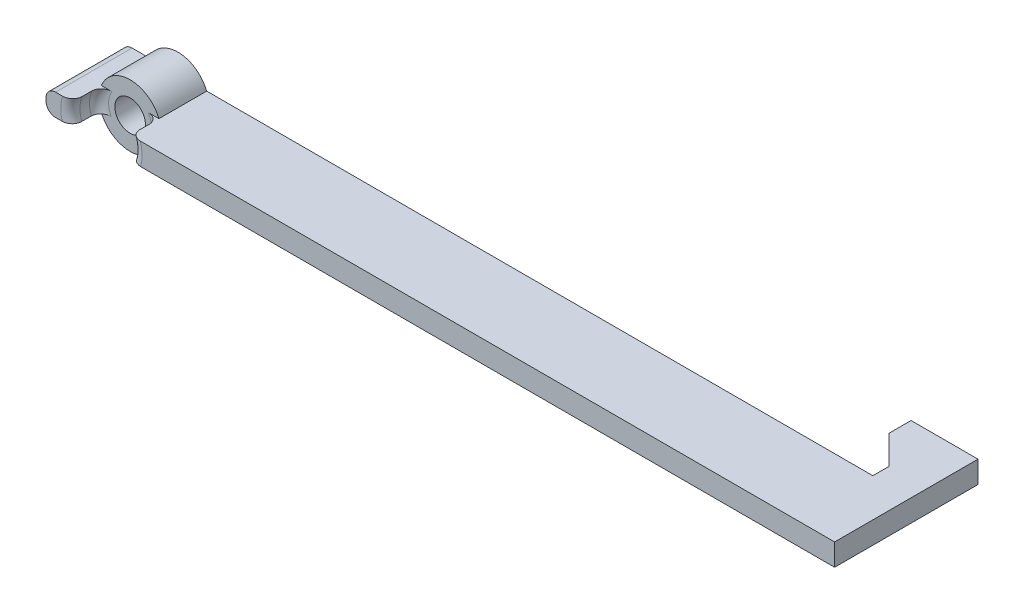
ISO-10303-21;
HEADER;
FILE_DESCRIPTION(('STEP AP214'),'2;1');
FILE_NAME('part.step','',(''),(''),'','','');
FILE_SCHEMA(('AUTOMOTIVE_DESIGN { 1 0 10303 214 1 1 1 1 }'));
ENDSEC;
DATA;
#1=APPLICATION_CONTEXT('core data for automotive mechanical design processes');
#2=APPLICATION_PROTOCOL_DEFINITION('international standard','automotive_design',2000,#1);
#3=PRODUCT_CONTEXT('',#1,'mechanical');
#4=PRODUCT('Part','Part','',(#3));
#5=PRODUCT_RELATED_PRODUCT_CATEGORY('part','',(#4));
#6=PRODUCT_DEFINITION_FORMATION('','',#4);
#7=PRODUCT_DEFINITION_CONTEXT('part definition',#1,'design');
#8=PRODUCT_DEFINITION('design','',#6,#7);
#9=PRODUCT_DEFINITION_SHAPE('','',#8);
#10=(LENGTH_UNIT() NAMED_UNIT(*) SI_UNIT(.MILLI.,.METRE.));
#11=(NAMED_UNIT(*) PLANE_ANGLE_UNIT() SI_UNIT($,.RADIAN.));
#12=(NAMED_UNIT(*) SI_UNIT($,.STERADIAN.) SOLID_ANGLE_UNIT());
#13=UNCERTAINTY_MEASURE_WITH_UNIT(LENGTH_MEASURE(1.E-05),#10,'distance_accuracy_value','');
#14=(GEOMETRIC_REPRESENTATION_CONTEXT(3) GLOBAL_UNCERTAINTY_ASSIGNED_CONTEXT((#13)) GLOBAL_UNIT_ASSIGNED_CONTEXT((#10,
#11,#12)) REPRESENTATION_CONTEXT('',''));
#15=CARTESIAN_POINT('',(0.,0.,0.));
#16=DIRECTION('',(0.,0.,1.));
#17=DIRECTION('',(1.,0.,0.));
#18=AXIS2_PLACEMENT_3D('',#15,#16,#17);
#19=CARTESIAN_POINT('',(0.,2.3,0.));
#20=DIRECTION('',(1.,0.,0.));
#21=DIRECTION('',(0.,0.,-1.));
#22=AXIS2_PLACEMENT_3D('',#19,#20,#21);
#23=PLANE('',#22);
#24=DIRECTION('',(0.,1.,0.));
#25=VECTOR('',#24,1.);
#26=CARTESIAN_POINT('',(0.,0.,-1.7));
#27=LINE('',#26,#25);
#28=CARTESIAN_POINT('',(0.,0.,-1.7));
#29=VERTEX_POINT('',#28);
#30=CARTESIAN_POINT('',(0.,2.3,-1.7));
#31=VERTEX_POINT('',#30);
#32=EDGE_CURVE('E204',#29,#31,#27,.T.);
#33=ORIENTED_EDGE('',*,*,#32,.F.);
#34=DIRECTION('',(0.,0.,1.));
#35=VECTOR('',#34,1.);
#36=CARTESIAN_POINT('',(0.,0.,0.));
#37=LINE('',#36,#35);
#38=CARTESIAN_POINT('',(0.,0.,0.));
#39=VERTEX_POINT('',#38);
#40=EDGE_CURVE('E193',#29,#39,#37,.T.);
#41=ORIENTED_EDGE('',*,*,#40,.T.);
#42=DIRECTION('',(0.,-1.,0.));
#43=VECTOR('',#42,1.);
#44=CARTESIAN_POINT('',(0.,2.3,0.));
#45=LINE('',#44,#43);
#46=CARTESIAN_POINT('',(0.,2.3,0.));
#47=VERTEX_POINT('',#46);
#48=EDGE_CURVE('E253',#47,#39,#45,.T.);
#49=ORIENTED_EDGE('',*,*,#48,.F.);
#50=DIRECTION('',(0.,0.,1.));
#51=VECTOR('',#50,1.);
#52=CARTESIAN_POINT('',(0.,2.3,0.));
#53=LINE('',#52,#51);
#54=EDGE_CURVE('E238',#31,#47,#53,.T.);
#55=ORIENTED_EDGE('',*,*,#54,.F.);
#56=EDGE_LOOP('',(#33,#41,#49,#55));
#57=FACE_BOUND('',#56,.T.);
#58=ADVANCED_FACE('F35',(#57),#23,.F.);
#59=CARTESIAN_POINT('',(4.,2.3,7.99999999999999));
#60=DIRECTION('',(0.,0.,-1.));
#61=DIRECTION('',(-1.,0.,0.));
#62=AXIS2_PLACEMENT_3D('',#59,#60,#61);
#63=PLANE('',#62);
#64=DIRECTION('',(1.,0.,0.));
#65=VECTOR('',#64,1.);
#66=CARTESIAN_POINT('',(4.,2.3,7.99999999999999));
#67=LINE('',#66,#65);
#68=CARTESIAN_POINT('',(-68.6298331944321,2.3,8.));
#69=VERTEX_POINT('',#68);
#70=CARTESIAN_POINT('',(4.,2.3,7.99999999999999));
#71=VERTEX_POINT('',#70);
#72=EDGE_CURVE('E230',#69,#71,#67,.T.);
#73=ORIENTED_EDGE('',*,*,#72,.F.);
#74=CARTESIAN_POINT('',(-72.7,1.07679021633533,8.));
#75=DIRECTION('',(0.,0.,-1.));
#76=DIRECTION('',(-1.,0.,0.));
#77=AXIS2_PLACEMENT_3D('',#74,#75,#76);
#78=CIRCLE('',#77,4.25000000000001);
#79=CARTESIAN_POINT('',(-68.5886714033047,0.,8.));
#80=VERTEX_POINT('',#79);
#81=EDGE_CURVE('E401',#69,#80,#78,.T.);
#82=ORIENTED_EDGE('',*,*,#81,.T.);
#83=DIRECTION('',(1.,0.,0.));
#84=VECTOR('',#83,1.);
#85=CARTESIAN_POINT('',(4.,0.,7.99999999999999));
#86=LINE('',#85,#84);
#87=CARTESIAN_POINT('',(4.,0.,7.99999999999999));
#88=VERTEX_POINT('',#87);
#89=EDGE_CURVE('E229',#80,#88,#86,.T.);
#90=ORIENTED_EDGE('',*,*,#89,.T.);
#91=DIRECTION('',(0.,-1.,0.));
#92=VECTOR('',#91,1.);
#93=CARTESIAN_POINT('',(4.,2.3,7.99999999999999));
#94=LINE('',#93,#92);
#95=EDGE_CURVE('E257',#71,#88,#94,.T.);
#96=ORIENTED_EDGE('',*,*,#95,.F.);
#97=EDGE_LOOP('',(#73,#82,#90,#96));
#98=FACE_BOUND('',#97,.T.);
#99=ADVANCED_FACE('F358',(#98),#63,.F.);
#100=CARTESIAN_POINT('',(-72.7,1.07679021633533,17.1923881554251));
#101=DIRECTION('',(0.,0.,-1.));
#102=DIRECTION('',(-1.,0.,0.));
#103=AXIS2_PLACEMENT_3D('',#100,#101,#102);
#104=CYLINDRICAL_SURFACE('',#103,3.25000000000001);
#105=DIRECTION('',(0.,0.,-1.));
#106=VECTOR('',#105,1.);
#107=CARTESIAN_POINT('',(-69.6335651270564,0.,17.1923881554251));
#108=LINE('',#107,#106);
#109=CARTESIAN_POINT('',(-69.6335651270564,0.,0.));
#110=VERTEX_POINT('',#109);
#111=CARTESIAN_POINT('',(-69.6335651270564,0.,4.99999999999999));
#112=VERTEX_POINT('',#111);
#113=EDGE_CURVE('E264',#110,#112,#108,.F.);
#114=ORIENTED_EDGE('',*,*,#113,.T.);
#115=CARTESIAN_POINT('',(-72.7,1.07679021633533,4.99999999999999));
#116=DIRECTION('',(0.,0.,1.));
#117=DIRECTION('',(1.,0.,0.));
#118=AXIS2_PLACEMENT_3D('',#115,#116,#117);
#119=CIRCLE('',#118,3.25000000000001);
#120=CARTESIAN_POINT('',(-75.7664348729436,0.,4.99999999999999));
#121=VERTEX_POINT('',#120);
#122=EDGE_CURVE('E208',#121,#112,#119,.T.);
#123=ORIENTED_EDGE('',*,*,#122,.F.);
#124=DIRECTION('',(0.,0.,-1.));
#125=VECTOR('',#124,1.);
#126=CARTESIAN_POINT('',(-75.7664348729436,0.,17.1923881554251));
#127=LINE('',#126,#125);
#128=CARTESIAN_POINT('',(-75.7664348729436,0.,0.));
#129=VERTEX_POINT('',#128);
#130=EDGE_CURVE('E267',#121,#129,#127,.T.);
#131=ORIENTED_EDGE('',*,*,#130,.T.);
#132=CARTESIAN_POINT('',(-72.7,1.07679021633533,0.));
#133=DIRECTION('',(0.,0.,-1.));
#134=DIRECTION('',(-1.,0.,0.));
#135=AXIS2_PLACEMENT_3D('',#132,#133,#134);
#136=CIRCLE('',#135,3.25000000000001);
#137=EDGE_CURVE('E217',#110,#129,#136,.T.);
#138=ORIENTED_EDGE('',*,*,#137,.F.);
#139=EDGE_LOOP('',(#114,#123,#131,#138));
#140=FACE_BOUND('',#139,.T.);
#141=ADVANCED_FACE('F295',(#140),#104,.T.);
#142=DIRECTION('',(0.,0.,-1.));
#143=VECTOR('',#142,1.);
#144=CARTESIAN_POINT('',(-75.7110227207956,2.3,17.1923881554251));
#145=LINE('',#144,#143);
#146=CARTESIAN_POINT('',(-75.7110227207956,2.3,4.99999999999999));
#147=VERTEX_POINT('',#146);
#148=CARTESIAN_POINT('',(-75.7110227207956,2.3,0.));
#149=VERTEX_POINT('',#148);
#150=EDGE_CURVE('E225',#147,#149,#145,.T.);
#151=ORIENTED_EDGE('',*,*,#150,.F.);
#152=CARTESIAN_POINT('',(-69.6889772792044,2.3,4.99999999999999));
#153=VERTEX_POINT('',#152);
#154=EDGE_CURVE('E210',#153,#147,#119,.T.);
#155=ORIENTED_EDGE('',*,*,#154,.F.);
#156=DIRECTION('',(0.,0.,-1.));
#157=VECTOR('',#156,1.);
#158=CARTESIAN_POINT('',(-69.6889772792044,2.3,17.1923881554251));
#159=LINE('',#158,#157);
#160=CARTESIAN_POINT('',(-69.6889772792044,2.3,0.));
#161=VERTEX_POINT('',#160);
#162=EDGE_CURVE('E222',#161,#153,#159,.F.);
#163=ORIENTED_EDGE('',*,*,#162,.F.);
#164=EDGE_CURVE('E218',#149,#161,#136,.T.);
#165=ORIENTED_EDGE('',*,*,#164,.F.);
#166=EDGE_LOOP('',(#151,#155,#163,#165));
#167=FACE_BOUND('',#166,.T.);
#168=ADVANCED_FACE('F444',(#167),#104,.T.);
#169=CARTESIAN_POINT('',(-72.7,1.07679021633533,12.5254833995939));
#170=DIRECTION('',(0.,0.,-1.));
#171=DIRECTION('',(-1.,0.,0.));
#172=AXIS2_PLACEMENT_3D('',#169,#170,#171);
#173=CYLINDRICAL_SURFACE('',#172,1.60000000000001);
#174=CARTESIAN_POINT('',(-72.7,1.07679021633533,0.));
#175=DIRECTION('',(0.,0.,-1.));
#176=DIRECTION('',(-1.,0.,0.));
#177=AXIS2_PLACEMENT_3D('',#174,#175,#176);
#178=CIRCLE('',#177,1.60000000000001);
#179=CARTESIAN_POINT('',(-74.3,1.07679021633533,0.));
#180=VERTEX_POINT('',#179);
#181=EDGE_CURVE('E214',#180,#180,#178,.T.);
#182=ORIENTED_EDGE('',*,*,#181,.T.);
#183=EDGE_LOOP('',(#182));
#184=FACE_BOUND('',#183,.T.);
#185=CARTESIAN_POINT('',(-72.7,1.07679021633533,4.99999999999999));
#186=DIRECTION('',(0.,0.,1.));
#187=DIRECTION('',(1.,0.,0.));
#188=AXIS2_PLACEMENT_3D('',#185,#186,#187);
#189=CIRCLE('',#188,1.60000000000001);
#190=CARTESIAN_POINT('',(-71.1,1.07679021633533,4.99999999999999));
#191=VERTEX_POINT('',#190);
#192=EDGE_CURVE('E213',#191,#191,#189,.F.);
#193=ORIENTED_EDGE('',*,*,#192,.F.);
#194=EDGE_LOOP('',(#193));
#195=FACE_BOUND('',#194,.T.);
#196=ADVANCED_FACE('F623',(#184,#195),#173,.F.);
#197=CARTESIAN_POINT('',(0.,2.3,0.));
#198=DIRECTION('',(0.,-1.,0.));
#199=DIRECTION('',(0.,0.,-1.));
#200=AXIS2_PLACEMENT_3D('',#197,#198,#199);
#201=PLANE('',#200);
#202=DIRECTION('',(-1.,0.,0.));
#203=VECTOR('',#202,1.);
#204=CARTESIAN_POINT('',(-78.5,2.3,0.));
#205=LINE('',#204,#203);
#206=CARTESIAN_POINT('',(-77.5,2.3,0.));
#207=VERTEX_POINT('',#206);
#208=EDGE_CURVE('E240',#149,#207,#205,.T.);
#209=ORIENTED_EDGE('',*,*,#208,.T.);
#210=DIRECTION('',(0.,0.,1.));
#211=VECTOR('',#210,1.);
#212=CARTESIAN_POINT('',(-77.5,2.3,0.));
#213=LINE('',#212,#211);
#214=CARTESIAN_POINT('',(-77.5,2.3,8.));
#215=VERTEX_POINT('',#214);
#216=EDGE_CURVE('E281',#207,#215,#213,.T.);
#217=ORIENTED_EDGE('',*,*,#216,.T.);
#218=CARTESIAN_POINT('',(-76.7701668055679,2.3,8.));
#219=VERTEX_POINT('',#218);
#220=EDGE_CURVE('E232',#215,#219,#67,.T.);
#221=ORIENTED_EDGE('',*,*,#220,.T.);
#222=CARTESIAN_POINT('',(-76.7701668055679,2.3,8.));
#223=CARTESIAN_POINT('',(-76.7084793020716,2.3,8.00003628166796));
#224=CARTESIAN_POINT('',(-76.6468129296311,2.3,7.99476679889679));
#225=CARTESIAN_POINT('',(-76.5252270284778,2.3,7.97400991228585));
#226=CARTESIAN_POINT('',(-76.4653073512022,2.3,7.95852338010756));
#227=CARTESIAN_POINT('',(-76.348886886151,2.3,7.91771836285723));
#228=CARTESIAN_POINT('',(-76.2923873654929,2.3,7.89239625930906));
#229=CARTESIAN_POINT('',(-76.1844912141994,2.3,7.83255453870914));
#230=CARTESIAN_POINT('',(-76.1330936020468,2.3,7.79803669548075));
#231=CARTESIAN_POINT('',(-76.0374776405936,2.3,7.7209760643413));
#232=CARTESIAN_POINT('',(-75.9931975907792,2.3,7.67851002971978));
#233=CARTESIAN_POINT('',(-75.9128411218953,2.3,7.58638298972124));
#234=CARTESIAN_POINT('',(-75.8767645163178,2.3,7.53672214796268));
#235=CARTESIAN_POINT('',(-75.8159286699387,2.3,7.43426156700221));
#236=CARTESIAN_POINT('',(-75.7906908007749,2.3,7.38174604062904));
#237=CARTESIAN_POINT('',(-75.7501652850212,2.3,7.27304603560976));
#238=CARTESIAN_POINT('',(-75.7348604807912,2.3,7.21686806895597));
#239=CARTESIAN_POINT('',(-75.720280800891,2.3,7.1334290201641));
#240=CARTESIAN_POINT('',(-75.7168113612721,2.3,7.10684542254565));
#241=CARTESIAN_POINT('',(-75.7121836279468,2.3,7.05351290005322));
#242=CARTESIAN_POINT('',(-75.7110223220466,2.3,7.02676423641359));
#243=CARTESIAN_POINT('',(-75.7110227207956,2.3,7.));
#244=B_SPLINE_CURVE_WITH_KNOTS('',3,(#222,#223,#224,#225,#226,#227,#228,#229,#230,#231,#232,
#233,#234,#235,#236,#237,#238,#239,#240,#241,#242,#243),.UNSPECIFIED.,.F.,.F.,(4,2,2,2,2,2,2,2,
2,2,4),(0.,0.184810026736351,0.369604288553864,0.554466600097478,0.739293278188422,
0.922419503712392,1.10554156538214,1.2794372901815,1.45303183527789,1.53337370125212,
1.61361064929914),.UNSPECIFIED.);
#245=CARTESIAN_POINT('',(-75.7110227207956,2.3,7.));
#246=VERTEX_POINT('',#245);
#247=EDGE_CURVE('E271',#219,#246,#244,.T.);
#248=ORIENTED_EDGE('',*,*,#247,.T.);
#249=CARTESIAN_POINT('',(-75.7110227207956,2.3,5.99999999999999));
#250=VERTEX_POINT('',#249);
#251=EDGE_CURVE('E226',#246,#250,#145,.T.);
#252=ORIENTED_EDGE('',*,*,#251,.T.);
#253=CARTESIAN_POINT('',(-75.7110227207956,2.3,5.99999999999999));
#254=CARTESIAN_POINT('',(-75.7110232626971,2.3,5.9735052240556));
#255=CARTESIAN_POINT('',(-75.7098854086374,2.3,5.94702354296903));
#256=CARTESIAN_POINT('',(-75.7053510431203,2.3,5.8942583169622));
#257=CARTESIAN_POINT('',(-75.7019548788933,2.3,5.86797474220997));
#258=CARTESIAN_POINT('',(-75.6884348932536,2.3,5.78983615144535));
#259=CARTESIAN_POINT('',(-75.6749793022308,2.3,5.73851919777151));
#260=CARTESIAN_POINT('',(-75.639671757554,2.3,5.63890135444684));
#261=CARTESIAN_POINT('',(-75.6178201007659,2.3,5.59060035822874));
#262=CARTESIAN_POINT('',(-75.5664894294616,2.3,5.49822575774662));
#263=CARTESIAN_POINT('',(-75.5370081175038,2.3,5.45415343230868));
#264=CARTESIAN_POINT('',(-75.4706451271862,2.3,5.37032085902143));
#265=CARTESIAN_POINT('',(-75.4336078325851,2.3,5.33068415771887));
#266=CARTESIAN_POINT('',(-75.3537880996448,2.3,5.25773428673599));
#267=CARTESIAN_POINT('',(-75.3110059810041,2.3,5.2244207654205));
#268=CARTESIAN_POINT('',(-75.2179232493511,2.3,5.16260396010052));
#269=CARTESIAN_POINT('',(-75.1673112891156,2.3,5.13457073447228));
#270=CARTESIAN_POINT('',(-75.0623759722074,2.3,5.08646985891002));
#271=CARTESIAN_POINT('',(-75.0080473391747,2.3,5.0664138208155));
#272=CARTESIAN_POINT('',(-74.8934438273873,2.3,5.03319527901055));
#273=CARTESIAN_POINT('',(-74.8330133705287,2.3,5.02057680233252));
#274=CARTESIAN_POINT('',(-74.7111694627277,2.3,5.0039727604889));
#275=CARTESIAN_POINT('',(-74.649759974041,2.3,4.99995847185423));
#276=CARTESIAN_POINT('',(-74.5884538186429,2.3,4.99999999999999));
#277=B_SPLINE_CURVE_WITH_KNOTS('',3,(#253,#254,#255,#256,#257,#258,#259,#260,#261,#262,#263,
#264,#265,#266,#267,#268,#269,#270,#271,#272,#273,#274,#275,#276),.UNSPECIFIED.,.F.,.F.,(4,2,2,
2,2,2,2,2,2,2,2,4),(0.,0.0794340962300351,0.158855981754892,0.317184376059872,0.475507172745226,
0.633877699169134,0.795917060797725,0.957947408695623,1.13080281141146,1.30390891492781,
1.48847066627677,1.67241532696246),.UNSPECIFIED.);
#278=CARTESIAN_POINT('',(-74.5884538186429,2.3,4.99999999999999));
#279=VERTEX_POINT('',#278);
#280=EDGE_CURVE('E312',#250,#279,#277,.T.);
#281=ORIENTED_EDGE('',*,*,#280,.T.);
#282=DIRECTION('',(1.,0.,0.));
#283=VECTOR('',#282,1.);
#284=CARTESIAN_POINT('',(-72.7,2.3,4.99999999999999));
#285=LINE('',#284,#283);
#286=EDGE_CURVE('E414',#147,#279,#285,.T.);
#287=ORIENTED_EDGE('',*,*,#286,.F.);
#288=ORIENTED_EDGE('',*,*,#150,.T.);
#289=EDGE_LOOP('',(#209,#217,#221,#248,#252,#281,#287,#288));
#290=FACE_BOUND('',#289,.T.);
#291=ADVANCED_FACE('F294',(#290),#201,.F.);
#292=CARTESIAN_POINT('',(0.,0.,0.));
#293=DIRECTION('',(0.,-1.,0.));
#294=DIRECTION('',(0.,0.,-1.));
#295=AXIS2_PLACEMENT_3D('',#292,#293,#294);
#296=PLANE('',#295);
#297=CARTESIAN_POINT('',(-77.5,0.,8.));
#298=VERTEX_POINT('',#297);
#299=CARTESIAN_POINT('',(-76.8113285966953,0.,8.));
#300=VERTEX_POINT('',#299);
#301=EDGE_CURVE('E245',#298,#300,#86,.T.);
#302=ORIENTED_EDGE('',*,*,#301,.F.);
#303=DIRECTION('',(0.,0.,1.));
#304=VECTOR('',#303,1.);
#305=CARTESIAN_POINT('',(-77.5,0.,0.));
#306=LINE('',#305,#304);
#307=CARTESIAN_POINT('',(-77.5,0.,0.));
#308=VERTEX_POINT('',#307);
#309=EDGE_CURVE('E456',#298,#308,#306,.F.);
#310=ORIENTED_EDGE('',*,*,#309,.T.);
#311=DIRECTION('',(-1.,0.,0.));
#312=VECTOR('',#311,1.);
#313=CARTESIAN_POINT('',(-78.5,0.,0.));
#314=LINE('',#313,#312);
#315=EDGE_CURVE('E248',#129,#308,#314,.T.);
#316=ORIENTED_EDGE('',*,*,#315,.F.);
#317=ORIENTED_EDGE('',*,*,#130,.F.);
#318=DIRECTION('',(-1.,0.,0.));
#319=VECTOR('',#318,1.);
#320=CARTESIAN_POINT('',(0.,0.,4.99999999999999));
#321=LINE('',#320,#319);
#322=CARTESIAN_POINT('',(-74.6756069523072,0.,4.99999999999999));
#323=VERTEX_POINT('',#322);
#324=EDGE_CURVE('E419',#323,#121,#321,.T.);
#325=ORIENTED_EDGE('',*,*,#324,.F.);
#326=CARTESIAN_POINT('',(-74.6756069523072,0.,4.99999999999999));
#327=CARTESIAN_POINT('',(-74.7090274255551,0.,5.00000068904523));
#328=CARTESIAN_POINT('',(-74.7424380873697,0.,5.00129285138581));
#329=CARTESIAN_POINT('',(-74.8090674786979,0.,5.00654129470269));
#330=CARTESIAN_POINT('',(-74.8422860874046,0.,5.0104991001755));
#331=CARTESIAN_POINT('',(-74.9415471697443,0.,5.0265245764561));
#332=CARTESIAN_POINT('',(-75.0069801087128,0.,5.04274538108086));
#333=CARTESIAN_POINT('',(-75.1342129533945,0.,5.08652969735452));
#334=CARTESIAN_POINT('',(-75.1959986374403,0.,5.11413463770462));
#335=CARTESIAN_POINT('',(-75.3132657119715,0.,5.1803362930904));
#336=CARTESIAN_POINT('',(-75.3687602751288,0.,5.21890942471922));
#337=CARTESIAN_POINT('',(-75.4664005147829,0.,5.30203977710945));
#338=CARTESIAN_POINT('',(-75.5093087364456,0.,5.34570216635517));
#339=CARTESIAN_POINT('',(-75.5864565449831,0.,5.44017033391898));
#340=CARTESIAN_POINT('',(-75.6206943121453,0.,5.49097760829632));
#341=CARTESIAN_POINT('',(-75.6767767578137,0.,5.59393748447642));
#342=CARTESIAN_POINT('',(-75.699376097865,0.,5.64568087326071));
#343=CARTESIAN_POINT('',(-75.7350942791199,0.,5.75229706672286));
#344=CARTESIAN_POINT('',(-75.7482290969488,0.,5.80716442818224));
#345=CARTESIAN_POINT('',(-75.7597393631419,0.,5.88543852883627));
#346=CARTESIAN_POINT('',(-75.7622503828411,0.,5.90829756239432));
#347=CARTESIAN_POINT('',(-75.7655962560331,0.,5.95410058614523));
#348=CARTESIAN_POINT('',(-75.76643383129,0.,5.97704437747974));
#349=CARTESIAN_POINT('',(-75.7664348729438,0.,5.99999999999995));
#350=B_SPLINE_CURVE_WITH_KNOTS('',3,(#326,#327,#328,#329,#330,#331,#332,#333,#334,#335,#336,
#337,#338,#339,#340,#341,#342,#343,#344,#345,#346,#347,#348,#349),.UNSPECIFIED.,.F.,.F.,(4,2,2,
2,2,2,2,2,2,2,2,4),(0.,0.100212853177123,0.200483067377465,0.401660231195516,0.603576063706577,
0.805060985148805,0.987736037051734,1.17044939618425,1.33900665267208,1.50727870454302,
1.57621898409396,1.64504704454937),.UNSPECIFIED.);
#351=CARTESIAN_POINT('',(-75.7664348729436,0.,5.99999999999999));
#352=VERTEX_POINT('',#351);
#353=EDGE_CURVE('E319',#323,#352,#350,.T.);
#354=ORIENTED_EDGE('',*,*,#353,.T.);
#355=CARTESIAN_POINT('',(-75.7664348729436,0.,7.));
#356=VERTEX_POINT('',#355);
#357=EDGE_CURVE('E268',#356,#352,#127,.T.);
#358=ORIENTED_EDGE('',*,*,#357,.F.);
#359=CARTESIAN_POINT('',(-75.7664348729436,0.,7.));
#360=CARTESIAN_POINT('',(-75.7664339434348,0.,7.02708754688897));
#361=CARTESIAN_POINT('',(-75.7676021687059,0.,7.05416156122703));
#362=CARTESIAN_POINT('',(-75.772255283119,0.,7.10810455051351));
#363=CARTESIAN_POINT('',(-75.7757397209928,0.,7.13497356437101));
#364=CARTESIAN_POINT('',(-75.7896040335199,0.,7.21484035235909));
#365=CARTESIAN_POINT('',(-75.8033952456551,0.,7.26728469948472));
#366=CARTESIAN_POINT('',(-75.8395316933238,0.,7.36908215077579));
#367=CARTESIAN_POINT('',(-75.8618749788424,0.,7.41843595665313));
#368=CARTESIAN_POINT('',(-75.9143119331562,0.,7.51285456521532));
#369=CARTESIAN_POINT('',(-75.9444085127079,0.,7.55791774838562));
#370=CARTESIAN_POINT('',(-76.0123113928244,0.,7.64386687953739));
#371=CARTESIAN_POINT('',(-76.0503096563918,0.,7.68460088385169));
#372=CARTESIAN_POINT('',(-76.1323150872758,0.,7.75949384390999));
#373=CARTESIAN_POINT('',(-76.1763240222754,0.,7.7936508582742));
#374=CARTESIAN_POINT('',(-76.2714874923135,0.,7.85619185182079));
#375=CARTESIAN_POINT('',(-76.3228904514077,0.,7.8841978486304));
#376=CARTESIAN_POINT('',(-76.4295599312125,0.,7.93147909407194));
#377=CARTESIAN_POINT('',(-76.4848257297999,0.,7.9507559695225));
#378=CARTESIAN_POINT('',(-76.5853338184707,0.,7.97688654217252));
#379=CARTESIAN_POINT('',(-76.6301180763736,0.,7.98553709933932));
#380=CARTESIAN_POINT('',(-76.7203720237144,0.,7.99709550161666));
#381=CARTESIAN_POINT('',(-76.7658409262242,0.,8.00000949795543));
#382=CARTESIAN_POINT('',(-76.8113285966953,0.,8.));
#383=B_SPLINE_CURVE_WITH_KNOTS('',3,(#359,#360,#361,#362,#363,#364,#365,#366,#367,#368,#369,
#370,#371,#372,#373,#374,#375,#376,#377,#378,#379,#380,#381,#382),.UNSPECIFIED.,.F.,.F.,(4,2,2,
2,2,2,2,2,2,2,2,4),(0.,0.0812108835898923,0.162405949479171,0.3242429832652,0.486043137477846,
0.647904123758225,0.81428879761123,0.980722509447689,1.15554912319839,1.33034314164523,
1.46682552576527,1.60316148198245),.UNSPECIFIED.);
#384=EDGE_CURVE('E453',#356,#300,#383,.T.);
#385=ORIENTED_EDGE('',*,*,#384,.T.);
#386=EDGE_LOOP('',(#302,#310,#316,#317,#325,#354,#358,#385));
#387=FACE_BOUND('',#386,.T.);
#388=ADVANCED_FACE('F378',(#387),#296,.T.);
#389=CARTESIAN_POINT('',(-78.5,2.3,8.));
#390=DIRECTION('',(1.,0.,0.));
#391=DIRECTION('',(0.,0.,-1.));
#392=AXIS2_PLACEMENT_3D('',#389,#390,#391);
#393=PLANE('',#392);
#394=DIRECTION('',(0.,-1.,0.));
#395=VECTOR('',#394,1.);
#396=CARTESIAN_POINT('',(-78.5,2.3,8.));
#397=LINE('',#396,#395);
#398=CARTESIAN_POINT('',(-78.5,1.3,8.));
#399=VERTEX_POINT('',#398);
#400=CARTESIAN_POINT('',(-78.5,1.,8.));
#401=VERTEX_POINT('',#400);
#402=EDGE_CURVE('E260',#399,#401,#397,.T.);
#403=ORIENTED_EDGE('',*,*,#402,.F.);
#404=DIRECTION('',(0.,0.,1.));
#405=VECTOR('',#404,1.);
#406=CARTESIAN_POINT('',(-78.5,1.3,8.));
#407=LINE('',#406,#405);
#408=CARTESIAN_POINT('',(-78.5,1.3,0.));
#409=VERTEX_POINT('',#408);
#410=EDGE_CURVE('E458',#399,#409,#407,.F.);
#411=ORIENTED_EDGE('',*,*,#410,.T.);
#412=DIRECTION('',(0.,-1.,0.));
#413=VECTOR('',#412,1.);
#414=CARTESIAN_POINT('',(-78.5,2.3,0.));
#415=LINE('',#414,#413);
#416=CARTESIAN_POINT('',(-78.5,1.,0.));
#417=VERTEX_POINT('',#416);
#418=EDGE_CURVE('E243',#409,#417,#415,.T.);
#419=ORIENTED_EDGE('',*,*,#418,.T.);
#420=DIRECTION('',(0.,0.,1.));
#421=VECTOR('',#420,1.);
#422=CARTESIAN_POINT('',(-78.5,1.,8.));
#423=LINE('',#422,#421);
#424=EDGE_CURVE('E498',#417,#401,#423,.T.);
#425=ORIENTED_EDGE('',*,*,#424,.T.);
#426=EDGE_LOOP('',(#403,#411,#419,#425));
#427=FACE_BOUND('',#426,.T.);
#428=ADVANCED_FACE('F374',(#427),#393,.F.);
#429=ORIENTED_EDGE('',*,*,#220,.F.);
#430=CARTESIAN_POINT('',(-77.5,1.3,8.));
#431=DIRECTION('',(0.,0.,-1.));
#432=DIRECTION('',(-1.,0.,0.));
#433=AXIS2_PLACEMENT_3D('',#430,#431,#432);
#434=CIRCLE('',#433,1.);
#435=EDGE_CURVE('E500',#215,#399,#434,.F.);
#436=ORIENTED_EDGE('',*,*,#435,.T.);
#437=ORIENTED_EDGE('',*,*,#402,.T.);
#438=CARTESIAN_POINT('',(-77.5,1.,8.));
#439=DIRECTION('',(0.,0.,-1.));
#440=DIRECTION('',(-1.,0.,0.));
#441=AXIS2_PLACEMENT_3D('',#438,#439,#440);
#442=CIRCLE('',#441,1.);
#443=EDGE_CURVE('E496',#401,#298,#442,.F.);
#444=ORIENTED_EDGE('',*,*,#443,.T.);
#445=ORIENTED_EDGE('',*,*,#301,.T.);
#446=CARTESIAN_POINT('',(-72.7,1.07679021633533,8.));
#447=DIRECTION('',(0.,0.,-1.));
#448=DIRECTION('',(-1.,0.,0.));
#449=AXIS2_PLACEMENT_3D('',#446,#447,#448);
#450=CIRCLE('',#449,4.25000000000001);
#451=EDGE_CURVE('E504',#300,#219,#450,.T.);
#452=ORIENTED_EDGE('',*,*,#451,.T.);
#453=EDGE_LOOP('',(#429,#436,#437,#444,#445,#452));
#454=FACE_BOUND('',#453,.T.);
#455=ADVANCED_FACE('F365',(#454),#63,.F.);
#456=CARTESIAN_POINT('',(4.,2.3,-7.00000000000001));
#457=DIRECTION('',(-1.,0.,0.));
#458=DIRECTION('',(0.,0.,1.));
#459=AXIS2_PLACEMENT_3D('',#456,#457,#458);
#460=PLANE('',#459);
#461=DIRECTION('',(0.,0.,-1.));
#462=VECTOR('',#461,1.);
#463=CARTESIAN_POINT('',(4.,0.,-7.00000000000001));
#464=LINE('',#463,#462);
#465=CARTESIAN_POINT('',(4.,0.,-7.00000000000001));
#466=VERTEX_POINT('',#465);
#467=EDGE_CURVE('E194',#88,#466,#464,.T.);
#468=ORIENTED_EDGE('',*,*,#467,.T.);
#469=DIRECTION('',(0.,-1.,0.));
#470=VECTOR('',#469,1.);
#471=CARTESIAN_POINT('',(4.,2.3,-7.00000000000001));
#472=LINE('',#471,#470);
#473=CARTESIAN_POINT('',(4.,2.3,-7.00000000000001));
#474=VERTEX_POINT('',#473);
#475=EDGE_CURVE('E191',#474,#466,#472,.T.);
#476=ORIENTED_EDGE('',*,*,#475,.F.);
#477=DIRECTION('',(0.,0.,-1.));
#478=VECTOR('',#477,1.);
#479=CARTESIAN_POINT('',(4.,2.3,-7.00000000000001));
#480=LINE('',#479,#478);
#481=EDGE_CURVE('E234',#71,#474,#480,.T.);
#482=ORIENTED_EDGE('',*,*,#481,.F.);
#483=ORIENTED_EDGE('',*,*,#95,.T.);
#484=EDGE_LOOP('',(#468,#476,#482,#483));
#485=FACE_BOUND('',#484,.T.);
#486=ADVANCED_FACE('F369',(#485),#460,.F.);
#487=CARTESIAN_POINT('',(0.,2.3,-7.00000000000001));
#488=DIRECTION('',(0.,0.,1.));
#489=DIRECTION('',(1.,0.,0.));
#490=AXIS2_PLACEMENT_3D('',#487,#488,#489);
#491=PLANE('',#490);
#492=DIRECTION('',(-1.,0.,0.));
#493=VECTOR('',#492,1.);
#494=CARTESIAN_POINT('',(0.,0.,-7.00000000000001));
#495=LINE('',#494,#493);
#496=CARTESIAN_POINT('',(-3.,0.,-7.00000000000001));
#497=VERTEX_POINT('',#496);
#498=EDGE_CURVE('E185',#466,#497,#495,.T.);
#499=ORIENTED_EDGE('',*,*,#498,.T.);
#500=DIRECTION('',(0.,-1.,0.));
#501=VECTOR('',#500,1.);
#502=CARTESIAN_POINT('',(-3.,0.,-7.00000000000001));
#503=LINE('',#502,#501);
#504=CARTESIAN_POINT('',(-3.,2.3,-7.00000000000001));
#505=VERTEX_POINT('',#504);
#506=EDGE_CURVE('E189',#505,#497,#503,.T.);
#507=ORIENTED_EDGE('',*,*,#506,.F.);
#508=DIRECTION('',(-1.,0.,0.));
#509=VECTOR('',#508,1.);
#510=CARTESIAN_POINT('',(0.,2.3,-7.00000000000001));
#511=LINE('',#510,#509);
#512=EDGE_CURVE('E236',#474,#505,#511,.T.);
#513=ORIENTED_EDGE('',*,*,#512,.F.);
#514=ORIENTED_EDGE('',*,*,#475,.T.);
#515=EDGE_LOOP('',(#499,#507,#513,#514));
#516=FACE_BOUND('',#515,.T.);
#517=ADVANCED_FACE('F186',(#516),#491,.F.);
#518=CARTESIAN_POINT('',(-78.5,2.3,0.));
#519=DIRECTION('',(0.,0.,1.));
#520=DIRECTION('',(1.,0.,0.));
#521=AXIS2_PLACEMENT_3D('',#518,#519,#520);
#522=PLANE('',#521);
#523=ORIENTED_EDGE('',*,*,#181,.F.);
#524=EDGE_LOOP('',(#523));
#525=FACE_BOUND('',#524,.T.);
#526=ORIENTED_EDGE('',*,*,#418,.F.);
#527=CARTESIAN_POINT('',(-77.5,1.3,0.));
#528=DIRECTION('',(0.,0.,1.));
#529=DIRECTION('',(1.,0.,0.));
#530=AXIS2_PLACEMENT_3D('',#527,#528,#529);
#531=CIRCLE('',#530,1.);
#532=EDGE_CURVE('E451',#409,#207,#531,.F.);
#533=ORIENTED_EDGE('',*,*,#532,.T.);
#534=ORIENTED_EDGE('',*,*,#208,.F.);
#535=ORIENTED_EDGE('',*,*,#164,.T.);
#536=EDGE_CURVE('E241',#47,#161,#205,.T.);
#537=ORIENTED_EDGE('',*,*,#536,.F.);
#538=ORIENTED_EDGE('',*,*,#48,.T.);
#539=EDGE_CURVE('E233',#39,#110,#314,.T.);
#540=ORIENTED_EDGE('',*,*,#539,.T.);
#541=ORIENTED_EDGE('',*,*,#137,.T.);
#542=ORIENTED_EDGE('',*,*,#315,.T.);
#543=CARTESIAN_POINT('',(-77.5,1.,0.));
#544=DIRECTION('',(0.,0.,1.));
#545=DIRECTION('',(1.,0.,0.));
#546=AXIS2_PLACEMENT_3D('',#543,#544,#545);
#547=CIRCLE('',#546,1.);
#548=EDGE_CURVE('E454',#308,#417,#547,.F.);
#549=ORIENTED_EDGE('',*,*,#548,.T.);
#550=EDGE_LOOP('',(#526,#533,#534,#535,#537,#538,#540,#541,#542,#549));
#551=FACE_BOUND('',#550,.T.);
#552=ADVANCED_FACE('F292',(#525,#551),#522,.F.);
#553=DIRECTION('',(0.,0.,-1.));
#554=VECTOR('',#553,1.);
#555=CARTESIAN_POINT('',(-3.,2.3,-7.00000000000001));
#556=LINE('',#555,#554);
#557=CARTESIAN_POINT('',(-3.,2.3,-4.7));
#558=VERTEX_POINT('',#557);
#559=EDGE_CURVE('E199',#558,#505,#556,.T.);
#560=ORIENTED_EDGE('',*,*,#559,.F.);
#561=DIRECTION('',(-0.707106781186548,0.,-0.707106781186547));
#562=VECTOR('',#561,1.);
#563=CARTESIAN_POINT('',(-3.,2.3,-4.7));
#564=LINE('',#563,#562);
#565=EDGE_CURVE('E44',#558,#31,#564,.F.);
#566=ORIENTED_EDGE('',*,*,#565,.T.);
#567=ORIENTED_EDGE('',*,*,#54,.T.);
#568=ORIENTED_EDGE('',*,*,#536,.T.);
#569=ORIENTED_EDGE('',*,*,#162,.T.);
#570=DIRECTION('',(1.,0.,0.));
#571=VECTOR('',#570,1.);
#572=CARTESIAN_POINT('',(-72.7,2.3,4.99999999999999));
#573=LINE('',#572,#571);
#574=CARTESIAN_POINT('',(-70.8115461813571,2.3,4.99999999999999));
#575=VERTEX_POINT('',#574);
#576=EDGE_CURVE('E412',#575,#153,#573,.T.);
#577=ORIENTED_EDGE('',*,*,#576,.F.);
#578=CARTESIAN_POINT('',(-70.8115461813571,2.3,4.99999999999999));
#579=CARTESIAN_POINT('',(-70.7760104532668,2.3,5.00000085708769));
#580=CARTESIAN_POINT('',(-70.7404830804914,2.3,5.00133574199818));
#581=CARTESIAN_POINT('',(-70.6696164473074,2.3,5.00679883344536));
#582=CARTESIAN_POINT('',(-70.6342773638186,2.3,5.01092931576619));
#583=CARTESIAN_POINT('',(-70.5285084991888,2.3,5.02775951526121));
#584=CARTESIAN_POINT('',(-70.4587148982414,2.3,5.04490082845419));
#585=CARTESIAN_POINT('',(-70.3229928261293,2.3,5.09161465659027));
#586=CARTESIAN_POINT('',(-70.2570856865169,2.3,5.12124959975095));
#587=CARTESIAN_POINT('',(-70.1324421449753,2.3,5.19274761746729));
#588=CARTESIAN_POINT('',(-70.0736840193738,2.3,5.23457226547921));
#589=CARTESIAN_POINT('',(-69.9731829929628,2.3,5.32319844432243));
#590=CARTESIAN_POINT('',(-69.9302180997743,2.3,5.36861655924005));
#591=CARTESIAN_POINT('',(-69.8535442571083,2.3,5.46676695166108));
#592=CARTESIAN_POINT('',(-69.8198374217272,2.3,5.51950089561815));
#593=CARTESIAN_POINT('',(-69.7661759866786,2.3,5.62483333154886));
#594=CARTESIAN_POINT('',(-69.7451714498463,2.3,5.6769002376762));
#595=CARTESIAN_POINT('',(-69.7127953473834,2.3,5.78388880414084));
#596=CARTESIAN_POINT('',(-69.7014033699654,2.3,5.83880415122239));
#597=CARTESIAN_POINT('',(-69.6930150015946,2.3,5.91178456087184));
#598=CARTESIAN_POINT('',(-69.6915004520382,2.3,5.92940768954688));
#599=CARTESIAN_POINT('',(-69.6894830105475,2.3,5.96468448153033));
#600=CARTESIAN_POINT('',(-69.6889785598331,2.3,5.98233805564783));
#601=CARTESIAN_POINT('',(-69.6889772792044,2.3,5.99999999999999));
#602=B_SPLINE_CURVE_WITH_KNOTS('',3,(#578,#579,#580,#581,#582,#583,#584,#585,#586,#587,#588,
#589,#590,#591,#592,#593,#594,#595,#596,#597,#598,#599,#600,#601),.UNSPECIFIED.,.F.,.F.,(4,2,2,
2,2,2,2,2,2,2,2,4),(0.,0.106559591770098,0.213206033947683,0.427648727549265,0.643175892655687,
0.85803085095982,1.04455561838715,1.2311229437825,1.39871743039911,1.56595513649362,
1.61899897556331,1.67196089432831),.UNSPECIFIED.);
#603=CARTESIAN_POINT('',(-69.6889772792044,2.3,5.99999999999999));
#604=VERTEX_POINT('',#603);
#605=EDGE_CURVE('E318',#575,#604,#602,.T.);
#606=ORIENTED_EDGE('',*,*,#605,.T.);
#607=CARTESIAN_POINT('',(-69.6889772792044,2.3,7.));
#608=VERTEX_POINT('',#607);
#609=EDGE_CURVE('E221',#604,#608,#159,.F.);
#610=ORIENTED_EDGE('',*,*,#609,.T.);
#611=CARTESIAN_POINT('',(-69.6889772792044,2.3,7.));
#612=CARTESIAN_POINT('',(-69.6889785477059,2.3,7.02677529264485));
#613=CARTESIAN_POINT('',(-69.687815729685,2.3,7.05353701657777));
#614=CARTESIAN_POINT('',(-69.6831864338887,2.3,7.10685409621262));
#615=CARTESIAN_POINT('',(-69.6797205117405,2.3,7.13340950012665));
#616=CARTESIAN_POINT('',(-69.6659400296055,2.3,7.21231059726241));
#617=CARTESIAN_POINT('',(-69.6522423150588,2.3,7.26410333208408));
#618=CARTESIAN_POINT('',(-69.6164127011562,2.3,7.36461199447424));
#619=CARTESIAN_POINT('',(-69.5942845637694,2.3,7.41332928313453));
#620=CARTESIAN_POINT('',(-69.5424381799985,2.3,7.50656360496706));
#621=CARTESIAN_POINT('',(-69.5127158868507,2.3,7.55107838133581));
#622=CARTESIAN_POINT('',(-69.4454931757676,2.3,7.63641139504619));
#623=CARTESIAN_POINT('',(-69.4077514591364,2.3,7.67703910285028));
#624=CARTESIAN_POINT('',(-69.3263608155521,2.3,7.75186945252776));
#625=CARTESIAN_POINT('',(-69.2827100505801,2.3,7.78607008731324));
#626=CARTESIAN_POINT('',(-69.1876405683606,2.3,7.84940349070154));
#627=CARTESIAN_POINT('',(-69.1358991490483,2.3,7.87805203660211));
#628=CARTESIAN_POINT('',(-69.0284856135634,2.3,7.92665346073275));
#629=CARTESIAN_POINT('',(-68.9728137649173,2.3,7.94660693013577));
#630=CARTESIAN_POINT('',(-68.8693212718776,2.3,7.97456662670588));
#631=CARTESIAN_POINT('',(-68.8219018597096,2.3,7.98408100737039));
#632=CARTESIAN_POINT('',(-68.7262719750473,2.3,7.99680010565824));
#633=CARTESIAN_POINT('',(-68.6780623116886,2.3,8.00001091468145));
#634=CARTESIAN_POINT('',(-68.6298331944321,2.3,8.));
#635=B_SPLINE_CURVE_WITH_KNOTS('',3,(#611,#612,#613,#614,#615,#616,#617,#618,#619,#620,#621,
#622,#623,#624,#625,#626,#627,#628,#629,#630,#631,#632,#633,#634),.UNSPECIFIED.,.F.,.F.,(4,2,2,
2,2,2,2,2,2,2,2,4),(0.,0.0802740855491039,0.160528811886289,0.320410273854187,0.480220474156693,
0.640116012167943,0.805762297134226,0.971460225541835,1.14810745166644,1.32474266577899,
1.46942939316783,1.61397623488132),.UNSPECIFIED.);
#636=EDGE_CURVE('E304',#608,#69,#635,.T.);
#637=ORIENTED_EDGE('',*,*,#636,.T.);
#638=ORIENTED_EDGE('',*,*,#72,.T.);
#639=ORIENTED_EDGE('',*,*,#481,.T.);
#640=ORIENTED_EDGE('',*,*,#512,.T.);
#641=EDGE_LOOP('',(#560,#566,#567,#568,#569,#577,#606,#610,#637,#638,#639,#640));
#642=FACE_BOUND('',#641,.T.);
#643=ADVANCED_FACE('F287',(#642),#201,.F.);
#644=ORIENTED_EDGE('',*,*,#40,.F.);
#645=DIRECTION('',(0.707106781186548,0.,0.707106781186547));
#646=VECTOR('',#645,1.);
#647=CARTESIAN_POINT('',(0.850000000000005,0.,-0.850000000000007));
#648=LINE('',#647,#646);
#649=CARTESIAN_POINT('',(-3.,0.,-4.7));
#650=VERTEX_POINT('',#649);
#651=EDGE_CURVE('E11',#29,#650,#648,.F.);
#652=ORIENTED_EDGE('',*,*,#651,.T.);
#653=DIRECTION('',(0.,0.,1.));
#654=VECTOR('',#653,1.);
#655=CARTESIAN_POINT('',(-3.,0.,-7.00000000000001));
#656=LINE('',#655,#654);
#657=EDGE_CURVE('E196',#497,#650,#656,.T.);
#658=ORIENTED_EDGE('',*,*,#657,.F.);
#659=ORIENTED_EDGE('',*,*,#498,.F.);
#660=ORIENTED_EDGE('',*,*,#467,.F.);
#661=ORIENTED_EDGE('',*,*,#89,.F.);
#662=CARTESIAN_POINT('',(-68.5886714033047,0.,8.));
#663=CARTESIAN_POINT('',(-68.6490313113149,0.,8.00003928539847));
#664=CARTESIAN_POINT('',(-68.7093720616342,0.,7.9948880352838));
#665=CARTESIAN_POINT('',(-68.8283349036399,0.,7.97458654147727));
#666=CARTESIAN_POINT('',(-68.8869574110799,0.,7.95943873780718));
#667=CARTESIAN_POINT('',(-69.0008573757739,0.,7.91951784638248));
#668=CARTESIAN_POINT('',(-69.0561334799272,0.,7.89474089478115));
#669=CARTESIAN_POINT('',(-69.1617015985119,0.,7.83620762137324));
#670=CARTESIAN_POINT('',(-69.2119946095939,0.,7.80245310013444));
#671=CARTESIAN_POINT('',(-69.30571503646,0.,7.72706573411015));
#672=CARTESIAN_POINT('',(-69.3491879488644,0.,7.68548955850754));
#673=CARTESIAN_POINT('',(-69.4282141930805,0.,7.59535976268737));
#674=CARTESIAN_POINT('',(-69.4637671618081,0.,7.54680582274695));
#675=CARTESIAN_POINT('',(-69.5243952759372,0.,7.44605018198395));
#676=CARTESIAN_POINT('',(-69.5498169941892,0.,7.3940569759492));
#677=CARTESIAN_POINT('',(-69.590993831413,0.,7.28640724128436));
#678=CARTESIAN_POINT('',(-69.6067628026231,0.,7.23075608970982));
#679=CARTESIAN_POINT('',(-69.6227507567871,0.,7.14546884098321));
#680=CARTESIAN_POINT('',(-69.6268032348904,0.,7.11650550801508));
#681=CARTESIAN_POINT('',(-69.6322093290484,0.,7.05836676798631));
#682=CARTESIAN_POINT('',(-69.6335665009062,0.,7.02919169136848));
#683=CARTESIAN_POINT('',(-69.6335651270564,0.,7.));
#684=B_SPLINE_CURVE_WITH_KNOTS('',3,(#662,#663,#664,#665,#666,#667,#668,#669,#670,#671,#672,
#673,#674,#675,#676,#677,#678,#679,#680,#681,#682,#683),.UNSPECIFIED.,.F.,.F.,(4,2,2,2,2,2,2,2,
2,2,4),(0.,0.180834690484573,0.361625258016195,0.542488445628425,0.723315386106194,
0.902879419275937,1.08245168273794,1.25520587925169,1.42771157894084,1.5153382900479,
1.60284932196063),.UNSPECIFIED.);
#685=CARTESIAN_POINT('',(-69.6335651270564,0.,7.));
#686=VERTEX_POINT('',#685);
#687=EDGE_CURVE('E394',#80,#686,#684,.T.);
#688=ORIENTED_EDGE('',*,*,#687,.T.);
#689=CARTESIAN_POINT('',(-69.6335651270564,0.,5.99999999999999));
#690=VERTEX_POINT('',#689);
#691=EDGE_CURVE('E263',#690,#686,#108,.F.);
#692=ORIENTED_EDGE('',*,*,#691,.F.);
#693=CARTESIAN_POINT('',(-69.6335651270564,0.,5.99999999999999));
#694=CARTESIAN_POINT('',(-69.6335647487659,0.,5.97312699134495));
#695=CARTESIAN_POINT('',(-69.6347139843592,0.,5.94626715937973));
#696=CARTESIAN_POINT('',(-69.6392948801433,0.,5.89274629906693));
#697=CARTESIAN_POINT('',(-69.6427262459307,0.,5.86608524552473));
#698=CARTESIAN_POINT('',(-69.656392427684,0.,5.78680136591764));
#699=CARTESIAN_POINT('',(-69.6699995559626,0.,5.73472069052587));
#700=CARTESIAN_POINT('',(-69.7057396261046,0.,5.63360455125095));
#701=CARTESIAN_POINT('',(-69.7278732783818,0.,5.58456934150565));
#702=CARTESIAN_POINT('',(-69.7799203929658,0.,5.49080998796457));
#703=CARTESIAN_POINT('',(-69.8098353445077,0.,5.44608667165486));
#704=CARTESIAN_POINT('',(-69.8770850505908,0.,5.36128777760898));
#705=CARTESIAN_POINT('',(-69.9145452779945,0.,5.32131194158024));
#706=CARTESIAN_POINT('',(-69.995343088151,0.,5.24785084992162));
#707=CARTESIAN_POINT('',(-70.0386807018415,0.,5.21436562845976));
#708=CARTESIAN_POINT('',(-70.1323547529892,0.,5.15291041707119));
#709=CARTESIAN_POINT('',(-70.1829377740879,0.,5.12531714919389));
#710=CARTESIAN_POINT('',(-70.2878018081165,0.,5.07828299915218));
#711=CARTESIAN_POINT('',(-70.3420865356937,0.,5.05885045044784));
#712=CARTESIAN_POINT('',(-70.4507070237035,0.,5.02882902000857));
#713=CARTESIAN_POINT('',(-70.5049560224494,0.,5.01792105199579));
#714=CARTESIAN_POINT('',(-70.6142863403535,0.,5.00350255505706));
#715=CARTESIAN_POINT('',(-70.669364999727,0.,4.99997202149175));
#716=CARTESIAN_POINT('',(-70.7243930476928,0.,4.99999999999999));
#717=B_SPLINE_CURVE_WITH_KNOTS('',3,(#693,#694,#695,#696,#697,#698,#699,#700,#701,#702,#703,
#704,#705,#706,#707,#708,#709,#710,#711,#712,#713,#714,#715,#716),.UNSPECIFIED.,.F.,.F.,(4,2,2,
2,2,2,2,2,2,2,2,4),(0.,0.0805684449541831,0.161126498287939,0.321777341766831,0.482441573266442,
0.64313657637146,0.80676489832703,0.970394081634974,1.14252081309907,1.3148228898516,
1.48031712332142,1.6453620174551),.UNSPECIFIED.);
#718=CARTESIAN_POINT('',(-70.7243930476928,0.,4.99999999999999));
#719=VERTEX_POINT('',#718);
#720=EDGE_CURVE('E340',#690,#719,#717,.T.);
#721=ORIENTED_EDGE('',*,*,#720,.T.);
#722=DIRECTION('',(-1.,0.,0.));
#723=VECTOR('',#722,1.);
#724=CARTESIAN_POINT('',(0.,0.,4.99999999999999));
#725=LINE('',#724,#723);
#726=EDGE_CURVE('E406',#112,#719,#725,.T.);
#727=ORIENTED_EDGE('',*,*,#726,.F.);
#728=ORIENTED_EDGE('',*,*,#113,.F.);
#729=ORIENTED_EDGE('',*,*,#539,.F.);
#730=EDGE_LOOP('',(#644,#652,#658,#659,#660,#661,#688,#692,#721,#727,#728,#729));
#731=FACE_BOUND('',#730,.T.);
#732=ADVANCED_FACE('F197',(#731),#296,.T.);
#733=CARTESIAN_POINT('',(-72.7,1.07679021633533,4.99999999999999));
#734=DIRECTION('',(0.,0.,1.));
#735=DIRECTION('',(1.,0.,0.));
#736=AXIS2_PLACEMENT_3D('',#733,#734,#735);
#737=CYLINDRICAL_SURFACE('',#736,3.25000000000001);
#738=ORIENTED_EDGE('',*,*,#251,.F.);
#739=CARTESIAN_POINT('',(-72.7,1.07679021633533,7.));
#740=DIRECTION('',(0.,0.,-1.));
#741=DIRECTION('',(-1.,0.,0.));
#742=AXIS2_PLACEMENT_3D('',#739,#740,#741);
#743=CIRCLE('',#742,3.25000000000001);
#744=EDGE_CURVE('E403',#246,#356,#743,.F.);
#745=ORIENTED_EDGE('',*,*,#744,.T.);
#746=ORIENTED_EDGE('',*,*,#357,.T.);
#747=CARTESIAN_POINT('',(-72.7,1.07679021633533,5.99999999999999));
#748=DIRECTION('',(0.,0.,1.));
#749=DIRECTION('',(1.,0.,0.));
#750=AXIS2_PLACEMENT_3D('',#747,#748,#749);
#751=CIRCLE('',#750,3.25000000000001);
#752=EDGE_CURVE('E400',#352,#250,#751,.F.);
#753=ORIENTED_EDGE('',*,*,#752,.T.);
#754=EDGE_LOOP('',(#738,#745,#746,#753));
#755=FACE_BOUND('',#754,.T.);
#756=ADVANCED_FACE('F432',(#755),#737,.F.);
#757=ORIENTED_EDGE('',*,*,#691,.T.);
#758=CARTESIAN_POINT('',(-72.7,1.07679021633533,7.));
#759=DIRECTION('',(0.,0.,-1.));
#760=DIRECTION('',(-1.,0.,0.));
#761=AXIS2_PLACEMENT_3D('',#758,#759,#760);
#762=CIRCLE('',#761,3.25000000000001);
#763=EDGE_CURVE('E468',#686,#608,#762,.F.);
#764=ORIENTED_EDGE('',*,*,#763,.T.);
#765=ORIENTED_EDGE('',*,*,#609,.F.);
#766=CARTESIAN_POINT('',(-72.7,1.07679021633533,5.99999999999999));
#767=DIRECTION('',(0.,0.,1.));
#768=DIRECTION('',(1.,0.,0.));
#769=AXIS2_PLACEMENT_3D('',#766,#767,#768);
#770=CIRCLE('',#769,3.25000000000001);
#771=EDGE_CURVE('E467',#604,#690,#770,.F.);
#772=ORIENTED_EDGE('',*,*,#771,.T.);
#773=EDGE_LOOP('',(#757,#764,#765,#772));
#774=FACE_BOUND('',#773,.T.);
#775=ADVANCED_FACE('F483',(#774),#737,.F.);
#776=CARTESIAN_POINT('',(-72.7,1.07679021633533,4.99999999999999));
#777=DIRECTION('',(0.,0.,1.));
#778=DIRECTION('',(1.,0.,0.));
#779=AXIS2_PLACEMENT_3D('',#776,#777,#778);
#780=PLANE('',#779);
#781=CARTESIAN_POINT('',(-72.7,1.07679021633533,4.99999999999999));
#782=DIRECTION('',(0.,0.,1.));
#783=DIRECTION('',(1.,0.,0.));
#784=AXIS2_PLACEMENT_3D('',#781,#782,#783);
#785=CIRCLE('',#784,2.25000000000001);
#786=EDGE_CURVE('E417',#279,#323,#785,.T.);
#787=ORIENTED_EDGE('',*,*,#786,.T.);
#788=ORIENTED_EDGE('',*,*,#324,.T.);
#789=ORIENTED_EDGE('',*,*,#122,.T.);
#790=ORIENTED_EDGE('',*,*,#726,.T.);
#791=CARTESIAN_POINT('',(-72.7,1.07679021633533,4.99999999999999));
#792=DIRECTION('',(0.,0.,1.));
#793=DIRECTION('',(1.,0.,0.));
#794=AXIS2_PLACEMENT_3D('',#791,#792,#793);
#795=CIRCLE('',#794,2.25000000000001);
#796=EDGE_CURVE('E409',#719,#575,#795,.T.);
#797=ORIENTED_EDGE('',*,*,#796,.T.);
#798=ORIENTED_EDGE('',*,*,#576,.T.);
#799=ORIENTED_EDGE('',*,*,#154,.T.);
#800=ORIENTED_EDGE('',*,*,#286,.T.);
#801=EDGE_LOOP('',(#787,#788,#789,#790,#797,#798,#799,#800));
#802=FACE_BOUND('',#801,.T.);
#803=ORIENTED_EDGE('',*,*,#192,.T.);
#804=EDGE_LOOP('',(#803));
#805=FACE_BOUND('',#804,.T.);
#806=ADVANCED_FACE('F384',(#802,#805),#780,.T.);
#807=CARTESIAN_POINT('',(-77.5,1.3,0.));
#808=DIRECTION('',(0.,0.,1.));
#809=DIRECTION('',(1.,0.,0.));
#810=AXIS2_PLACEMENT_3D('',#807,#808,#809);
#811=CYLINDRICAL_SURFACE('',#810,1.);
#812=ORIENTED_EDGE('',*,*,#532,.F.);
#813=ORIENTED_EDGE('',*,*,#410,.F.);
#814=ORIENTED_EDGE('',*,*,#435,.F.);
#815=ORIENTED_EDGE('',*,*,#216,.F.);
#816=EDGE_LOOP('',(#812,#813,#814,#815));
#817=FACE_BOUND('',#816,.T.);
#818=ADVANCED_FACE('F380',(#817),#811,.T.);
#819=CARTESIAN_POINT('',(-77.5,1.,8.));
#820=DIRECTION('',(0.,0.,-1.));
#821=DIRECTION('',(-1.,0.,0.));
#822=AXIS2_PLACEMENT_3D('',#819,#820,#821);
#823=CYLINDRICAL_SURFACE('',#822,1.);
#824=ORIENTED_EDGE('',*,*,#548,.F.);
#825=ORIENTED_EDGE('',*,*,#309,.F.);
#826=ORIENTED_EDGE('',*,*,#443,.F.);
#827=ORIENTED_EDGE('',*,*,#424,.F.);
#828=EDGE_LOOP('',(#824,#825,#826,#827));
#829=FACE_BOUND('',#828,.T.);
#830=ADVANCED_FACE('F383',(#829),#823,.T.);
#831=CARTESIAN_POINT('',(-72.7,1.07679021633533,7.));
#832=DIRECTION('',(0.,0.,-1.));
#833=DIRECTION('',(-1.,0.,0.));
#834=AXIS2_PLACEMENT_3D('',#831,#832,#833);
#835=TOROIDAL_SURFACE('',#834,4.25000000000001,1.);
#836=ORIENTED_EDGE('',*,*,#687,.F.);
#837=ORIENTED_EDGE('',*,*,#81,.F.);
#838=ORIENTED_EDGE('',*,*,#636,.F.);
#839=ORIENTED_EDGE('',*,*,#763,.F.);
#840=EDGE_LOOP('',(#836,#837,#838,#839));
#841=FACE_BOUND('',#840,.T.);
#842=ADVANCED_FACE('F387',(#841),#835,.T.);
#843=CARTESIAN_POINT('',(-72.7,1.07679021633533,7.));
#844=DIRECTION('',(0.,0.,-1.));
#845=DIRECTION('',(-1.,0.,0.));
#846=AXIS2_PLACEMENT_3D('',#843,#844,#845);
#847=TOROIDAL_SURFACE('',#846,4.25000000000001,1.);
#848=ORIENTED_EDGE('',*,*,#247,.F.);
#849=ORIENTED_EDGE('',*,*,#451,.F.);
#850=ORIENTED_EDGE('',*,*,#384,.F.);
#851=ORIENTED_EDGE('',*,*,#744,.F.);
#852=EDGE_LOOP('',(#848,#849,#850,#851));
#853=FACE_BOUND('',#852,.T.);
#854=ADVANCED_FACE('F283',(#853),#847,.T.);
#855=CARTESIAN_POINT('',(-72.7,1.07679021633533,5.99999999999999));
#856=DIRECTION('',(0.,0.,1.));
#857=DIRECTION('',(1.,0.,0.));
#858=AXIS2_PLACEMENT_3D('',#855,#856,#857);
#859=TOROIDAL_SURFACE('',#858,2.25000000000001,1.);
#860=ORIENTED_EDGE('',*,*,#280,.F.);
#861=ORIENTED_EDGE('',*,*,#752,.F.);
#862=ORIENTED_EDGE('',*,*,#353,.F.);
#863=ORIENTED_EDGE('',*,*,#786,.F.);
#864=EDGE_LOOP('',(#860,#861,#862,#863));
#865=FACE_BOUND('',#864,.T.);
#866=ADVANCED_FACE('F330',(#865),#859,.F.);
#867=CARTESIAN_POINT('',(-72.7,1.07679021633533,5.99999999999999));
#868=DIRECTION('',(0.,0.,1.));
#869=DIRECTION('',(1.,0.,0.));
#870=AXIS2_PLACEMENT_3D('',#867,#868,#869);
#871=TOROIDAL_SURFACE('',#870,2.25000000000001,1.);
#872=ORIENTED_EDGE('',*,*,#720,.F.);
#873=ORIENTED_EDGE('',*,*,#771,.F.);
#874=ORIENTED_EDGE('',*,*,#605,.F.);
#875=ORIENTED_EDGE('',*,*,#796,.F.);
#876=EDGE_LOOP('',(#872,#873,#874,#875));
#877=FACE_BOUND('',#876,.T.);
#878=ADVANCED_FACE('F333',(#877),#871,.F.);
#879=CARTESIAN_POINT('',(-3.,0.,0.));
#880=DIRECTION('',(1.,0.,0.));
#881=DIRECTION('',(0.,0.,-1.));
#882=AXIS2_PLACEMENT_3D('',#879,#880,#881);
#883=PLANE('',#882);
#884=ORIENTED_EDGE('',*,*,#657,.T.);
#885=DIRECTION('',(0.,1.,0.));
#886=VECTOR('',#885,1.);
#887=CARTESIAN_POINT('',(-3.,0.,-4.7));
#888=LINE('',#887,#886);
#889=EDGE_CURVE('E346',#650,#558,#888,.T.);
#890=ORIENTED_EDGE('',*,*,#889,.T.);
#891=ORIENTED_EDGE('',*,*,#559,.T.);
#892=ORIENTED_EDGE('',*,*,#506,.T.);
#893=EDGE_LOOP('',(#884,#890,#891,#892));
#894=FACE_BOUND('',#893,.T.);
#895=ADVANCED_FACE('F201',(#894),#883,.F.);
#896=CARTESIAN_POINT('',(-3.,0.,-4.7));
#897=DIRECTION('',(0.707106781186547,0.,-0.707106781186548));
#898=DIRECTION('',(0.,1.,0.));
#899=AXIS2_PLACEMENT_3D('',#896,#897,#898);
#900=PLANE('',#899);
#901=ORIENTED_EDGE('',*,*,#651,.F.);
#902=ORIENTED_EDGE('',*,*,#32,.T.);
#903=ORIENTED_EDGE('',*,*,#565,.F.);
#904=ORIENTED_EDGE('',*,*,#889,.F.);
#905=EDGE_LOOP('',(#901,#902,#903,#904));
#906=FACE_BOUND('',#905,.T.);
#907=ADVANCED_FACE('F38',(#906),#900,.F.);
#908=CLOSED_SHELL('',(#58,#99,#141,#168,#196,#291,#388,#428,#455,#486,#517,#552,#643,#732,#756,
#775,#806,#818,#830,#842,#854,#866,#878,#895,#907));
#909=MANIFOLD_SOLID_BREP('B2',#908);
#910=ADVANCED_BREP_SHAPE_REPRESENTATION('',(#18,#909),#14);
#911=SHAPE_DEFINITION_REPRESENTATION(#9,#910);
ENDSEC;
END-ISO-10303-21;
